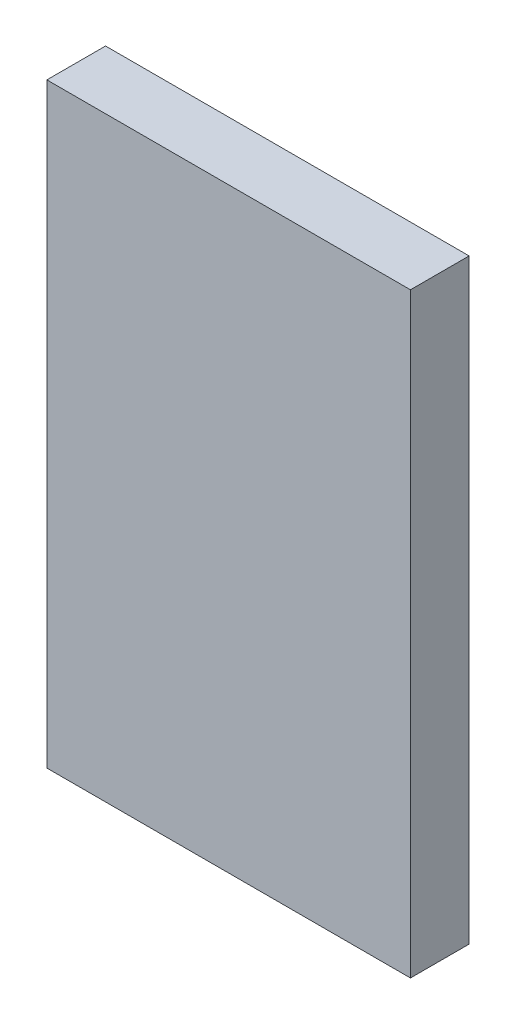
ISO-10303-21;
HEADER;
FILE_DESCRIPTION(('STEP AP214'),'2;1');
FILE_NAME('part.step','',(''),(''),'','','');
FILE_SCHEMA(('AUTOMOTIVE_DESIGN { 1 0 10303 214 1 1 1 1 }'));
ENDSEC;
DATA;
#1=APPLICATION_CONTEXT('core data for automotive mechanical design processes');
#2=APPLICATION_PROTOCOL_DEFINITION('international standard','automotive_design',2000,#1);
#3=PRODUCT_CONTEXT('',#1,'mechanical');
#4=PRODUCT('Part','Part','',(#3));
#5=PRODUCT_RELATED_PRODUCT_CATEGORY('part','',(#4));
#6=PRODUCT_DEFINITION_FORMATION('','',#4);
#7=PRODUCT_DEFINITION_CONTEXT('part definition',#1,'design');
#8=PRODUCT_DEFINITION('design','',#6,#7);
#9=PRODUCT_DEFINITION_SHAPE('','',#8);
#10=(LENGTH_UNIT() NAMED_UNIT(*) SI_UNIT(.MILLI.,.METRE.));
#11=(NAMED_UNIT(*) PLANE_ANGLE_UNIT() SI_UNIT($,.RADIAN.));
#12=(NAMED_UNIT(*) SI_UNIT($,.STERADIAN.) SOLID_ANGLE_UNIT());
#13=UNCERTAINTY_MEASURE_WITH_UNIT(LENGTH_MEASURE(1.E-05),#10,'distance_accuracy_value','');
#14=(GEOMETRIC_REPRESENTATION_CONTEXT(3) GLOBAL_UNCERTAINTY_ASSIGNED_CONTEXT((#13)) GLOBAL_UNIT_ASSIGNED_CONTEXT((#10,
#11,#12)) REPRESENTATION_CONTEXT('',''));
#15=CARTESIAN_POINT('',(0.,0.,0.));
#16=DIRECTION('',(0.,0.,1.));
#17=DIRECTION('',(1.,0.,0.));
#18=AXIS2_PLACEMENT_3D('',#15,#16,#17);
#19=CARTESIAN_POINT('',(21.082,13.716,1.6));
#20=DIRECTION('',(0.,0.,-1.));
#21=DIRECTION('',(0.,-1.,0.));
#22=AXIS2_PLACEMENT_3D('',#19,#20,#21);
#23=PLANE('',#22);
#24=DIRECTION('',(-1.,0.,0.));
#25=VECTOR('',#24,1.);
#26=CARTESIAN_POINT('',(17.9832,18.796,1.6));
#27=LINE('',#26,#25);
#28=CARTESIAN_POINT('',(24.1808,18.796,1.6));
#29=VERTEX_POINT('',#28);
#30=CARTESIAN_POINT('',(17.9832,18.796,1.6));
#31=VERTEX_POINT('',#30);
#32=EDGE_CURVE('E71',#29,#31,#27,.T.);
#33=ORIENTED_EDGE('',*,*,#32,.F.);
#34=DIRECTION('',(0.,1.,0.));
#35=VECTOR('',#34,1.);
#36=CARTESIAN_POINT('',(24.1808,18.796,1.6));
#37=LINE('',#36,#35);
#38=CARTESIAN_POINT('',(24.1808,8.636,1.6));
#39=VERTEX_POINT('',#38);
#40=EDGE_CURVE('E26',#39,#29,#37,.T.);
#41=ORIENTED_EDGE('',*,*,#40,.F.);
#42=DIRECTION('',(1.,0.,0.));
#43=VECTOR('',#42,1.);
#44=CARTESIAN_POINT('',(24.1808,8.636,1.6));
#45=LINE('',#44,#43);
#46=CARTESIAN_POINT('',(17.9832,8.636,1.6));
#47=VERTEX_POINT('',#46);
#48=EDGE_CURVE('E73',#47,#39,#45,.T.);
#49=ORIENTED_EDGE('',*,*,#48,.F.);
#50=DIRECTION('',(0.,-1.,0.));
#51=VECTOR('',#50,1.);
#52=CARTESIAN_POINT('',(17.9832,8.636,1.6));
#53=LINE('',#52,#51);
#54=EDGE_CURVE('E68',#31,#47,#53,.T.);
#55=ORIENTED_EDGE('',*,*,#54,.F.);
#56=EDGE_LOOP('',(#33,#41,#49,#55));
#57=FACE_BOUND('',#56,.T.);
#58=ADVANCED_FACE('F16',(#57),#23,.T.);
#59=CARTESIAN_POINT('',(21.082,13.716,2.6));
#60=DIRECTION('',(0.,0.,-1.));
#61=DIRECTION('',(0.,-1.,0.));
#62=AXIS2_PLACEMENT_3D('',#59,#60,#61);
#63=PLANE('',#62);
#64=DIRECTION('',(-1.,0.,0.));
#65=VECTOR('',#64,1.);
#66=CARTESIAN_POINT('',(17.9832,18.796,2.6));
#67=LINE('',#66,#65);
#68=CARTESIAN_POINT('',(24.1808,18.796,2.6));
#69=VERTEX_POINT('',#68);
#70=CARTESIAN_POINT('',(17.9832,18.796,2.6));
#71=VERTEX_POINT('',#70);
#72=EDGE_CURVE('E89',#69,#71,#67,.T.);
#73=ORIENTED_EDGE('',*,*,#72,.T.);
#74=DIRECTION('',(0.,-1.,0.));
#75=VECTOR('',#74,1.);
#76=CARTESIAN_POINT('',(17.9832,8.636,2.6));
#77=LINE('',#76,#75);
#78=CARTESIAN_POINT('',(17.9832,8.636,2.6));
#79=VERTEX_POINT('',#78);
#80=EDGE_CURVE('E84',#71,#79,#77,.T.);
#81=ORIENTED_EDGE('',*,*,#80,.T.);
#82=DIRECTION('',(1.,0.,0.));
#83=VECTOR('',#82,1.);
#84=CARTESIAN_POINT('',(24.1808,8.636,2.6));
#85=LINE('',#84,#83);
#86=CARTESIAN_POINT('',(24.1808,8.636,2.6));
#87=VERTEX_POINT('',#86);
#88=EDGE_CURVE('E99',#79,#87,#85,.T.);
#89=ORIENTED_EDGE('',*,*,#88,.T.);
#90=DIRECTION('',(0.,1.,0.));
#91=VECTOR('',#90,1.);
#92=CARTESIAN_POINT('',(24.1808,18.796,2.6));
#93=LINE('',#92,#91);
#94=EDGE_CURVE('E11',#87,#69,#93,.T.);
#95=ORIENTED_EDGE('',*,*,#94,.T.);
#96=EDGE_LOOP('',(#73,#81,#89,#95));
#97=FACE_BOUND('',#96,.T.);
#98=ADVANCED_FACE('F135',(#97),#63,.F.);
#99=CARTESIAN_POINT('',(24.1808,18.796,2.6));
#100=DIRECTION('',(-1.,0.,0.));
#101=DIRECTION('',(0.,0.,1.));
#102=AXIS2_PLACEMENT_3D('',#99,#100,#101);
#103=PLANE('',#102);
#104=ORIENTED_EDGE('',*,*,#40,.T.);
#105=DIRECTION('',(0.,0.,-1.));
#106=VECTOR('',#105,1.);
#107=CARTESIAN_POINT('',(24.1808,18.796,2.6));
#108=LINE('',#107,#106);
#109=EDGE_CURVE('E78',#69,#29,#108,.T.);
#110=ORIENTED_EDGE('',*,*,#109,.F.);
#111=ORIENTED_EDGE('',*,*,#94,.F.);
#112=DIRECTION('',(0.,0.,-1.));
#113=VECTOR('',#112,1.);
#114=CARTESIAN_POINT('',(24.1808,8.636,2.6));
#115=LINE('',#114,#113);
#116=EDGE_CURVE('E102',#87,#39,#115,.T.);
#117=ORIENTED_EDGE('',*,*,#116,.T.);
#118=EDGE_LOOP('',(#104,#110,#111,#117));
#119=FACE_BOUND('',#118,.T.);
#120=ADVANCED_FACE('F114',(#119),#103,.F.);
#121=CARTESIAN_POINT('',(24.1808,8.636,2.6));
#122=DIRECTION('',(0.,1.,0.));
#123=DIRECTION('',(1.,0.,0.));
#124=AXIS2_PLACEMENT_3D('',#121,#122,#123);
#125=PLANE('',#124);
#126=ORIENTED_EDGE('',*,*,#48,.T.);
#127=ORIENTED_EDGE('',*,*,#116,.F.);
#128=ORIENTED_EDGE('',*,*,#88,.F.);
#129=DIRECTION('',(0.,0.,-1.));
#130=VECTOR('',#129,1.);
#131=CARTESIAN_POINT('',(17.9832,8.636,2.6));
#132=LINE('',#131,#130);
#133=EDGE_CURVE('E20',#79,#47,#132,.T.);
#134=ORIENTED_EDGE('',*,*,#133,.T.);
#135=EDGE_LOOP('',(#126,#127,#128,#134));
#136=FACE_BOUND('',#135,.T.);
#137=ADVANCED_FACE('F18',(#136),#125,.F.);
#138=CARTESIAN_POINT('',(17.9832,8.636,2.6));
#139=DIRECTION('',(1.,0.,0.));
#140=DIRECTION('',(0.,-1.,0.));
#141=AXIS2_PLACEMENT_3D('',#138,#139,#140);
#142=PLANE('',#141);
#143=ORIENTED_EDGE('',*,*,#54,.T.);
#144=ORIENTED_EDGE('',*,*,#133,.F.);
#145=ORIENTED_EDGE('',*,*,#80,.F.);
#146=DIRECTION('',(0.,0.,-1.));
#147=VECTOR('',#146,1.);
#148=CARTESIAN_POINT('',(17.9832,18.796,2.6));
#149=LINE('',#148,#147);
#150=EDGE_CURVE('E81',#71,#31,#149,.T.);
#151=ORIENTED_EDGE('',*,*,#150,.T.);
#152=EDGE_LOOP('',(#143,#144,#145,#151));
#153=FACE_BOUND('',#152,.T.);
#154=ADVANCED_FACE('F82',(#153),#142,.F.);
#155=CARTESIAN_POINT('',(17.9832,18.796,2.6));
#156=DIRECTION('',(0.,-1.,0.));
#157=DIRECTION('',(-1.,0.,0.));
#158=AXIS2_PLACEMENT_3D('',#155,#156,#157);
#159=PLANE('',#158);
#160=ORIENTED_EDGE('',*,*,#32,.T.);
#161=ORIENTED_EDGE('',*,*,#150,.F.);
#162=ORIENTED_EDGE('',*,*,#72,.F.);
#163=ORIENTED_EDGE('',*,*,#109,.T.);
#164=EDGE_LOOP('',(#160,#161,#162,#163));
#165=FACE_BOUND('',#164,.T.);
#166=ADVANCED_FACE('F92',(#165),#159,.F.);
#167=CLOSED_SHELL('',(#58,#98,#120,#137,#154,#166));
#168=MANIFOLD_SOLID_BREP('B1',#167);
#169=ADVANCED_BREP_SHAPE_REPRESENTATION('',(#18,#168),#14);
#170=SHAPE_DEFINITION_REPRESENTATION(#9,#169);
ENDSEC;
END-ISO-10303-21;
